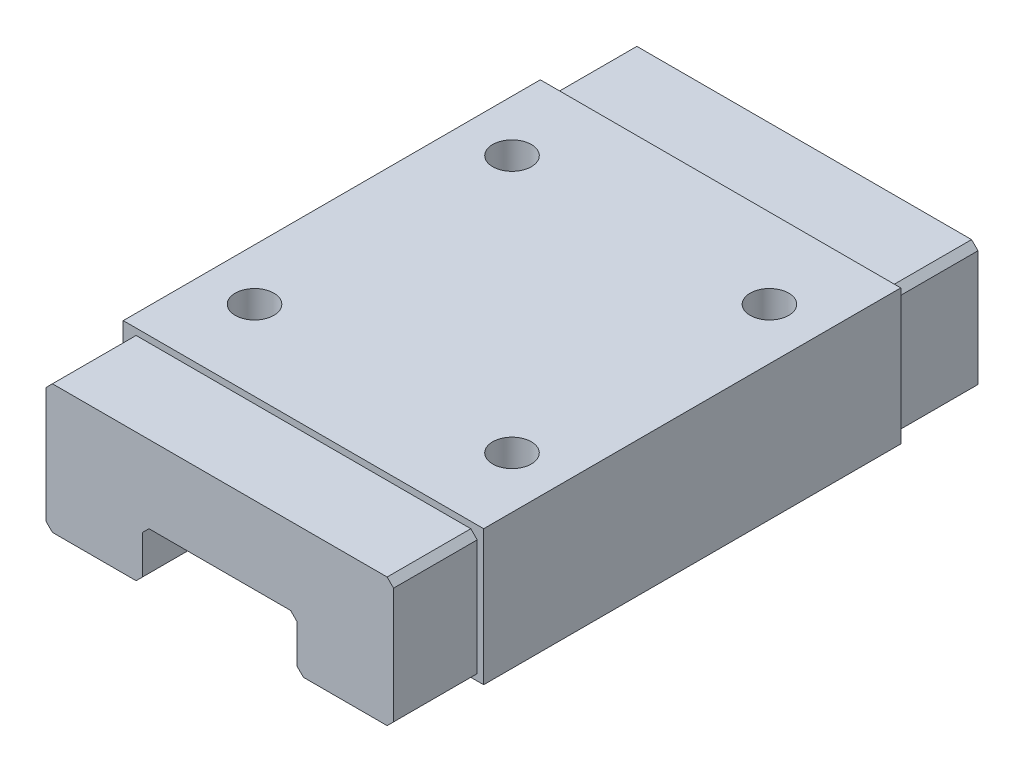
ISO-10303-21;
HEADER;
FILE_DESCRIPTION(('STEP AP214'),'2;1');
FILE_NAME('part.step','',(''),(''),'','','');
FILE_SCHEMA(('AUTOMOTIVE_DESIGN { 1 0 10303 214 1 1 1 1 }'));
ENDSEC;
DATA;
#1=APPLICATION_CONTEXT('core data for automotive mechanical design processes');
#2=APPLICATION_PROTOCOL_DEFINITION('international standard','automotive_design',2000,#1);
#3=PRODUCT_CONTEXT('',#1,'mechanical');
#4=PRODUCT('Part','Part','',(#3));
#5=PRODUCT_RELATED_PRODUCT_CATEGORY('part','',(#4));
#6=PRODUCT_DEFINITION_FORMATION('','',#4);
#7=PRODUCT_DEFINITION_CONTEXT('part definition',#1,'design');
#8=PRODUCT_DEFINITION('design','',#6,#7);
#9=PRODUCT_DEFINITION_SHAPE('','',#8);
#10=(LENGTH_UNIT() NAMED_UNIT(*) SI_UNIT(.MILLI.,.METRE.));
#11=(NAMED_UNIT(*) PLANE_ANGLE_UNIT() SI_UNIT($,.RADIAN.));
#12=(NAMED_UNIT(*) SI_UNIT($,.STERADIAN.) SOLID_ANGLE_UNIT());
#13=UNCERTAINTY_MEASURE_WITH_UNIT(LENGTH_MEASURE(1.E-05),#10,'distance_accuracy_value','');
#14=(GEOMETRIC_REPRESENTATION_CONTEXT(3) GLOBAL_UNCERTAINTY_ASSIGNED_CONTEXT((#13)) GLOBAL_UNIT_ASSIGNED_CONTEXT((#10,
#11,#12)) REPRESENTATION_CONTEXT('',''));
#15=CARTESIAN_POINT('',(0.,0.,0.));
#16=DIRECTION('',(0.,0.,1.));
#17=DIRECTION('',(1.,0.,0.));
#18=AXIS2_PLACEMENT_3D('',#15,#16,#17);
#19=CARTESIAN_POINT('',(13.5,0.,45.4));
#20=DIRECTION('',(-1.,0.,0.));
#21=DIRECTION('',(0.,-1.,0.));
#22=AXIS2_PLACEMENT_3D('',#19,#20,#21);
#23=PLANE('',#22);
#24=DIRECTION('',(0.,1.,0.));
#25=VECTOR('',#24,1.);
#26=CARTESIAN_POINT('',(13.5,0.,0.));
#27=LINE('',#26,#25);
#28=CARTESIAN_POINT('',(13.5,-9.49999999999999,0.));
#29=VERTEX_POINT('',#28);
#30=CARTESIAN_POINT('',(13.5,-0.500000000000001,0.));
#31=VERTEX_POINT('',#30);
#32=EDGE_CURVE('E279',#29,#31,#27,.T.);
#33=ORIENTED_EDGE('',*,*,#32,.T.);
#34=DIRECTION('',(0.,0.,1.));
#35=VECTOR('',#34,1.);
#36=CARTESIAN_POINT('',(13.5,-0.500000000000001,45.4));
#37=LINE('',#36,#35);
#38=CARTESIAN_POINT('',(13.5,-0.5,6.5));
#39=VERTEX_POINT('',#38);
#40=EDGE_CURVE('E349',#31,#39,#37,.T.);
#41=ORIENTED_EDGE('',*,*,#40,.T.);
#42=DIRECTION('',(0.,-1.,0.));
#43=VECTOR('',#42,1.);
#44=CARTESIAN_POINT('',(13.5,-10.,6.5));
#45=LINE('',#44,#43);
#46=CARTESIAN_POINT('',(13.5,-9.49999999999999,6.5));
#47=VERTEX_POINT('',#46);
#48=EDGE_CURVE('E240',#39,#47,#45,.T.);
#49=ORIENTED_EDGE('',*,*,#48,.T.);
#50=DIRECTION('',(0.,0.,-1.));
#51=VECTOR('',#50,1.);
#52=CARTESIAN_POINT('',(13.5,-9.49999999999999,45.4));
#53=LINE('',#52,#51);
#54=EDGE_CURVE('E346',#47,#29,#53,.T.);
#55=ORIENTED_EDGE('',*,*,#54,.T.);
#56=EDGE_LOOP('',(#33,#41,#49,#55));
#57=FACE_BOUND('',#56,.T.);
#58=ADVANCED_FACE('F34',(#57),#23,.F.);
#59=CARTESIAN_POINT('',(-13.5,0.,45.4));
#60=DIRECTION('',(0.,-1.,0.));
#61=DIRECTION('',(0.,0.,-1.));
#62=AXIS2_PLACEMENT_3D('',#59,#60,#61);
#63=PLANE('',#62);
#64=DIRECTION('',(1.,0.,0.));
#65=VECTOR('',#64,1.);
#66=CARTESIAN_POINT('',(13.5,0.,6.5));
#67=LINE('',#66,#65);
#68=CARTESIAN_POINT('',(-13.,0.,6.5));
#69=VERTEX_POINT('',#68);
#70=CARTESIAN_POINT('',(13.,0.,6.5));
#71=VERTEX_POINT('',#70);
#72=EDGE_CURVE('E225',#69,#71,#67,.T.);
#73=ORIENTED_EDGE('',*,*,#72,.T.);
#74=DIRECTION('',(0.,0.,-1.));
#75=VECTOR('',#74,1.);
#76=CARTESIAN_POINT('',(13.,0.,45.4));
#77=LINE('',#76,#75);
#78=CARTESIAN_POINT('',(13.,0.,0.));
#79=VERTEX_POINT('',#78);
#80=EDGE_CURVE('E331',#71,#79,#77,.T.);
#81=ORIENTED_EDGE('',*,*,#80,.T.);
#82=DIRECTION('',(-1.,0.,0.));
#83=VECTOR('',#82,1.);
#84=CARTESIAN_POINT('',(-13.5,0.,0.));
#85=LINE('',#84,#83);
#86=CARTESIAN_POINT('',(-13.,0.,0.));
#87=VERTEX_POINT('',#86);
#88=EDGE_CURVE('E311',#79,#87,#85,.T.);
#89=ORIENTED_EDGE('',*,*,#88,.T.);
#90=DIRECTION('',(0.,0.,1.));
#91=VECTOR('',#90,1.);
#92=CARTESIAN_POINT('',(-13.,0.,45.4));
#93=LINE('',#92,#91);
#94=EDGE_CURVE('E308',#87,#69,#93,.T.);
#95=ORIENTED_EDGE('',*,*,#94,.T.);
#96=EDGE_LOOP('',(#73,#81,#89,#95));
#97=FACE_BOUND('',#96,.T.);
#98=ADVANCED_FACE('F495',(#97),#63,.F.);
#99=CARTESIAN_POINT('',(-13.5,0.,45.4));
#100=DIRECTION('',(1.,0.,0.));
#101=DIRECTION('',(0.,1.,0.));
#102=AXIS2_PLACEMENT_3D('',#99,#100,#101);
#103=PLANE('',#102);
#104=DIRECTION('',(0.,1.,0.));
#105=VECTOR('',#104,1.);
#106=CARTESIAN_POINT('',(-13.5,0.,6.5));
#107=LINE('',#106,#105);
#108=CARTESIAN_POINT('',(-13.5,-9.50000000000001,6.5));
#109=VERTEX_POINT('',#108);
#110=CARTESIAN_POINT('',(-13.5,-0.499999999999994,6.5));
#111=VERTEX_POINT('',#110);
#112=EDGE_CURVE('E253',#109,#111,#107,.T.);
#113=ORIENTED_EDGE('',*,*,#112,.T.);
#114=DIRECTION('',(0.,0.,-1.));
#115=VECTOR('',#114,1.);
#116=CARTESIAN_POINT('',(-13.5,-0.499999999999994,45.4));
#117=LINE('',#116,#115);
#118=CARTESIAN_POINT('',(-13.5,-0.499999999999995,0.));
#119=VERTEX_POINT('',#118);
#120=EDGE_CURVE('E375',#111,#119,#117,.T.);
#121=ORIENTED_EDGE('',*,*,#120,.T.);
#122=DIRECTION('',(0.,-1.,0.));
#123=VECTOR('',#122,1.);
#124=CARTESIAN_POINT('',(-13.5,0.,0.));
#125=LINE('',#124,#123);
#126=CARTESIAN_POINT('',(-13.5,-9.50000000000001,0.));
#127=VERTEX_POINT('',#126);
#128=EDGE_CURVE('E314',#119,#127,#125,.T.);
#129=ORIENTED_EDGE('',*,*,#128,.T.);
#130=DIRECTION('',(0.,0.,1.));
#131=VECTOR('',#130,1.);
#132=CARTESIAN_POINT('',(-13.5,-9.50000000000001,45.4));
#133=LINE('',#132,#131);
#134=EDGE_CURVE('E373',#127,#109,#133,.T.);
#135=ORIENTED_EDGE('',*,*,#134,.T.);
#136=EDGE_LOOP('',(#113,#121,#129,#135));
#137=FACE_BOUND('',#136,.T.);
#138=ADVANCED_FACE('F487',(#137),#103,.F.);
#139=DIRECTION('',(0.,-1.,0.));
#140=VECTOR('',#139,1.);
#141=CARTESIAN_POINT('',(13.5,-10.,38.9));
#142=LINE('',#141,#140);
#143=CARTESIAN_POINT('',(13.5,-0.5,38.9));
#144=VERTEX_POINT('',#143);
#145=CARTESIAN_POINT('',(13.5,-9.49999999999999,38.9));
#146=VERTEX_POINT('',#145);
#147=EDGE_CURVE('E258',#144,#146,#142,.T.);
#148=ORIENTED_EDGE('',*,*,#147,.F.);
#149=DIRECTION('',(0.,0.,1.));
#150=VECTOR('',#149,1.);
#151=CARTESIAN_POINT('',(13.5,-0.500000000000001,45.4));
#152=LINE('',#151,#150);
#153=CARTESIAN_POINT('',(13.5,-0.500000000000001,45.4));
#154=VERTEX_POINT('',#153);
#155=EDGE_CURVE('E359',#144,#154,#152,.T.);
#156=ORIENTED_EDGE('',*,*,#155,.T.);
#157=DIRECTION('',(0.,1.,0.));
#158=VECTOR('',#157,1.);
#159=CARTESIAN_POINT('',(13.5,0.,45.4));
#160=LINE('',#159,#158);
#161=CARTESIAN_POINT('',(13.5,-9.49999999999999,45.4));
#162=VERTEX_POINT('',#161);
#163=EDGE_CURVE('E283',#162,#154,#160,.T.);
#164=ORIENTED_EDGE('',*,*,#163,.F.);
#165=DIRECTION('',(0.,0.,-1.));
#166=VECTOR('',#165,1.);
#167=CARTESIAN_POINT('',(13.5,-9.49999999999999,45.4));
#168=LINE('',#167,#166);
#169=EDGE_CURVE('E356',#162,#146,#168,.T.);
#170=ORIENTED_EDGE('',*,*,#169,.T.);
#171=EDGE_LOOP('',(#148,#156,#164,#170));
#172=FACE_BOUND('',#171,.T.);
#173=ADVANCED_FACE('F542',(#172),#23,.F.);
#174=DIRECTION('',(-1.,0.,0.));
#175=VECTOR('',#174,1.);
#176=CARTESIAN_POINT('',(-13.5,0.,45.4));
#177=LINE('',#176,#175);
#178=CARTESIAN_POINT('',(13.,0.,45.4));
#179=VERTEX_POINT('',#178);
#180=CARTESIAN_POINT('',(-13.,0.,45.4));
#181=VERTEX_POINT('',#180);
#182=EDGE_CURVE('E286',#179,#181,#177,.T.);
#183=ORIENTED_EDGE('',*,*,#182,.F.);
#184=DIRECTION('',(0.,0.,-1.));
#185=VECTOR('',#184,1.);
#186=CARTESIAN_POINT('',(13.,0.,45.4));
#187=LINE('',#186,#185);
#188=CARTESIAN_POINT('',(13.,0.,38.9));
#189=VERTEX_POINT('',#188);
#190=EDGE_CURVE('E353',#179,#189,#187,.T.);
#191=ORIENTED_EDGE('',*,*,#190,.T.);
#192=DIRECTION('',(1.,0.,0.));
#193=VECTOR('',#192,1.);
#194=CARTESIAN_POINT('',(13.5,0.,38.9));
#195=LINE('',#194,#193);
#196=CARTESIAN_POINT('',(-13.,0.,38.9));
#197=VERTEX_POINT('',#196);
#198=EDGE_CURVE('E243',#197,#189,#195,.T.);
#199=ORIENTED_EDGE('',*,*,#198,.F.);
#200=DIRECTION('',(0.,0.,1.));
#201=VECTOR('',#200,1.);
#202=CARTESIAN_POINT('',(-13.,0.,45.4));
#203=LINE('',#202,#201);
#204=EDGE_CURVE('E351',#197,#181,#203,.T.);
#205=ORIENTED_EDGE('',*,*,#204,.T.);
#206=EDGE_LOOP('',(#183,#191,#199,#205));
#207=FACE_BOUND('',#206,.T.);
#208=ADVANCED_FACE('F535',(#207),#63,.F.);
#209=DIRECTION('',(0.,-1.,0.));
#210=VECTOR('',#209,1.);
#211=CARTESIAN_POINT('',(-13.5,0.,45.4));
#212=LINE('',#211,#210);
#213=CARTESIAN_POINT('',(-13.5,-0.499999999999994,45.4));
#214=VERTEX_POINT('',#213);
#215=CARTESIAN_POINT('',(-13.5,-9.50000000000001,45.4));
#216=VERTEX_POINT('',#215);
#217=EDGE_CURVE('E290',#214,#216,#212,.T.);
#218=ORIENTED_EDGE('',*,*,#217,.F.);
#219=DIRECTION('',(0.,0.,-1.));
#220=VECTOR('',#219,1.);
#221=CARTESIAN_POINT('',(-13.5,-0.499999999999994,45.4));
#222=LINE('',#221,#220);
#223=CARTESIAN_POINT('',(-13.5,-0.499999999999994,38.9));
#224=VERTEX_POINT('',#223);
#225=EDGE_CURVE('E380',#214,#224,#222,.T.);
#226=ORIENTED_EDGE('',*,*,#225,.T.);
#227=DIRECTION('',(0.,1.,0.));
#228=VECTOR('',#227,1.);
#229=CARTESIAN_POINT('',(-13.5,0.,38.9));
#230=LINE('',#229,#228);
#231=CARTESIAN_POINT('',(-13.5,-9.50000000000001,38.9));
#232=VERTEX_POINT('',#231);
#233=EDGE_CURVE('E272',#232,#224,#230,.T.);
#234=ORIENTED_EDGE('',*,*,#233,.F.);
#235=DIRECTION('',(0.,0.,1.));
#236=VECTOR('',#235,1.);
#237=CARTESIAN_POINT('',(-13.5,-9.50000000000001,45.4));
#238=LINE('',#237,#236);
#239=EDGE_CURVE('E378',#232,#216,#238,.T.);
#240=ORIENTED_EDGE('',*,*,#239,.T.);
#241=EDGE_LOOP('',(#218,#226,#234,#240));
#242=FACE_BOUND('',#241,.T.);
#243=ADVANCED_FACE('F526',(#242),#103,.F.);
#244=CARTESIAN_POINT('',(-13.5,-10.,45.4));
#245=DIRECTION('',(0.,1.,0.));
#246=DIRECTION('',(-1.,0.,0.));
#247=AXIS2_PLACEMENT_3D('',#244,#245,#246);
#248=PLANE('',#247);
#249=DIRECTION('',(1.,0.,0.));
#250=VECTOR('',#249,1.);
#251=CARTESIAN_POINT('',(-13.5,-10.,6.5));
#252=LINE('',#251,#250);
#253=CARTESIAN_POINT('',(-14.,-10.,6.5));
#254=VERTEX_POINT('',#253);
#255=CARTESIAN_POINT('',(-13.,-10.,6.5));
#256=VERTEX_POINT('',#255);
#257=EDGE_CURVE('E251',#254,#256,#252,.T.);
#258=ORIENTED_EDGE('',*,*,#257,.T.);
#259=DIRECTION('',(0.,0.,-1.));
#260=VECTOR('',#259,1.);
#261=CARTESIAN_POINT('',(-13.,-10.,45.4));
#262=LINE('',#261,#260);
#263=CARTESIAN_POINT('',(-13.,-10.,0.));
#264=VERTEX_POINT('',#263);
#265=EDGE_CURVE('E388',#256,#264,#262,.T.);
#266=ORIENTED_EDGE('',*,*,#265,.T.);
#267=DIRECTION('',(1.,0.,0.));
#268=VECTOR('',#267,1.);
#269=CARTESIAN_POINT('',(-13.5,-10.,0.));
#270=LINE('',#269,#268);
#271=CARTESIAN_POINT('',(-6.49999999999999,-10.,0.));
#272=VERTEX_POINT('',#271);
#273=EDGE_CURVE('E317',#264,#272,#270,.T.);
#274=ORIENTED_EDGE('',*,*,#273,.T.);
#275=DIRECTION('',(0.,0.,1.));
#276=VECTOR('',#275,1.);
#277=CARTESIAN_POINT('',(-6.49999999999999,-10.,45.4));
#278=LINE('',#277,#276);
#279=CARTESIAN_POINT('',(-6.49999999999999,-10.,45.4));
#280=VERTEX_POINT('',#279);
#281=EDGE_CURVE('E383',#272,#280,#278,.T.);
#282=ORIENTED_EDGE('',*,*,#281,.T.);
#283=DIRECTION('',(1.,0.,0.));
#284=VECTOR('',#283,1.);
#285=CARTESIAN_POINT('',(-13.5,-10.,45.4));
#286=LINE('',#285,#284);
#287=CARTESIAN_POINT('',(-13.,-10.,45.4));
#288=VERTEX_POINT('',#287);
#289=EDGE_CURVE('E293',#288,#280,#286,.T.);
#290=ORIENTED_EDGE('',*,*,#289,.F.);
#291=DIRECTION('',(0.,0.,-1.));
#292=VECTOR('',#291,1.);
#293=CARTESIAN_POINT('',(-13.,-10.,45.4));
#294=LINE('',#293,#292);
#295=CARTESIAN_POINT('',(-13.,-10.,38.9));
#296=VERTEX_POINT('',#295);
#297=EDGE_CURVE('E385',#288,#296,#294,.T.);
#298=ORIENTED_EDGE('',*,*,#297,.T.);
#299=DIRECTION('',(1.,0.,0.));
#300=VECTOR('',#299,1.);
#301=CARTESIAN_POINT('',(-13.5,-10.,38.9));
#302=LINE('',#301,#300);
#303=CARTESIAN_POINT('',(-14.,-10.,38.9));
#304=VERTEX_POINT('',#303);
#305=EDGE_CURVE('E270',#304,#296,#302,.T.);
#306=ORIENTED_EDGE('',*,*,#305,.F.);
#307=DIRECTION('',(0.,0.,1.));
#308=VECTOR('',#307,1.);
#309=CARTESIAN_POINT('',(-14.,-10.,6.5));
#310=LINE('',#309,#308);
#311=EDGE_CURVE('E277',#254,#304,#310,.T.);
#312=ORIENTED_EDGE('',*,*,#311,.F.);
#313=EDGE_LOOP('',(#258,#266,#274,#282,#290,#298,#306,#312));
#314=FACE_BOUND('',#313,.T.);
#315=ADVANCED_FACE('F477',(#314),#248,.F.);
#316=CARTESIAN_POINT('',(-6.,-10.,45.4));
#317=DIRECTION('',(-1.,0.,0.));
#318=DIRECTION('',(0.,-1.,0.));
#319=AXIS2_PLACEMENT_3D('',#316,#317,#318);
#320=PLANE('',#319);
#321=DIRECTION('',(0.,1.,0.));
#322=VECTOR('',#321,1.);
#323=CARTESIAN_POINT('',(-6.,-10.,45.4));
#324=LINE('',#323,#322);
#325=CARTESIAN_POINT('',(-6.,-9.50000000000001,45.4));
#326=VERTEX_POINT('',#325);
#327=CARTESIAN_POINT('',(-6.,-6.5,45.4));
#328=VERTEX_POINT('',#327);
#329=EDGE_CURVE('E296',#326,#328,#324,.T.);
#330=ORIENTED_EDGE('',*,*,#329,.F.);
#331=DIRECTION('',(0.,0.,-1.));
#332=VECTOR('',#331,1.);
#333=CARTESIAN_POINT('',(-6.,-9.50000000000001,45.4));
#334=LINE('',#333,#332);
#335=CARTESIAN_POINT('',(-6.,-9.50000000000001,0.));
#336=VERTEX_POINT('',#335);
#337=EDGE_CURVE('E393',#326,#336,#334,.T.);
#338=ORIENTED_EDGE('',*,*,#337,.T.);
#339=DIRECTION('',(0.,1.,0.));
#340=VECTOR('',#339,1.);
#341=CARTESIAN_POINT('',(-6.,-10.,0.));
#342=LINE('',#341,#340);
#343=CARTESIAN_POINT('',(-6.,-6.5,0.));
#344=VERTEX_POINT('',#343);
#345=EDGE_CURVE('E320',#336,#344,#342,.T.);
#346=ORIENTED_EDGE('',*,*,#345,.T.);
#347=DIRECTION('',(0.,0.,1.));
#348=VECTOR('',#347,1.);
#349=CARTESIAN_POINT('',(-6.,-6.5,45.4));
#350=LINE('',#349,#348);
#351=EDGE_CURVE('E391',#344,#328,#350,.T.);
#352=ORIENTED_EDGE('',*,*,#351,.T.);
#353=EDGE_LOOP('',(#330,#338,#346,#352));
#354=FACE_BOUND('',#353,.T.);
#355=ADVANCED_FACE('F469',(#354),#320,.F.);
#356=CARTESIAN_POINT('',(6.00000000000001,-6.,45.4));
#357=DIRECTION('',(0.,1.,0.));
#358=DIRECTION('',(-1.,0.,0.));
#359=AXIS2_PLACEMENT_3D('',#356,#357,#358);
#360=PLANE('',#359);
#361=DIRECTION('',(1.,0.,0.));
#362=VECTOR('',#361,1.);
#363=CARTESIAN_POINT('',(6.00000000000001,-6.,45.4));
#364=LINE('',#363,#362);
#365=CARTESIAN_POINT('',(-5.49999999999999,-6.,45.4));
#366=VERTEX_POINT('',#365);
#367=CARTESIAN_POINT('',(5.50000000000001,-6.,45.4));
#368=VERTEX_POINT('',#367);
#369=EDGE_CURVE('E299',#366,#368,#364,.T.);
#370=ORIENTED_EDGE('',*,*,#369,.F.);
#371=DIRECTION('',(0.,0.,-1.));
#372=VECTOR('',#371,1.);
#373=CARTESIAN_POINT('',(-5.49999999999999,-6.,0.));
#374=LINE('',#373,#372);
#375=CARTESIAN_POINT('',(-5.49999999999999,-6.,0.));
#376=VERTEX_POINT('',#375);
#377=EDGE_CURVE('E398',#366,#376,#374,.T.);
#378=ORIENTED_EDGE('',*,*,#377,.T.);
#379=DIRECTION('',(1.,0.,0.));
#380=VECTOR('',#379,1.);
#381=CARTESIAN_POINT('',(6.00000000000001,-6.,0.));
#382=LINE('',#381,#380);
#383=CARTESIAN_POINT('',(5.50000000000001,-6.,0.));
#384=VERTEX_POINT('',#383);
#385=EDGE_CURVE('E323',#376,#384,#382,.T.);
#386=ORIENTED_EDGE('',*,*,#385,.T.);
#387=DIRECTION('',(0.,0.,1.));
#388=VECTOR('',#387,1.);
#389=CARTESIAN_POINT('',(5.50000000000001,-6.,45.4));
#390=LINE('',#389,#388);
#391=EDGE_CURVE('E396',#384,#368,#390,.T.);
#392=ORIENTED_EDGE('',*,*,#391,.T.);
#393=EDGE_LOOP('',(#370,#378,#386,#392));
#394=FACE_BOUND('',#393,.T.);
#395=ADVANCED_FACE('F460',(#394),#360,.F.);
#396=CARTESIAN_POINT('',(6.00000000000001,-10.,45.4));
#397=DIRECTION('',(1.,0.,0.));
#398=DIRECTION('',(0.,0.,-1.));
#399=AXIS2_PLACEMENT_3D('',#396,#397,#398);
#400=PLANE('',#399);
#401=DIRECTION('',(0.,-1.,0.));
#402=VECTOR('',#401,1.);
#403=CARTESIAN_POINT('',(6.00000000000001,-10.,45.4));
#404=LINE('',#403,#402);
#405=CARTESIAN_POINT('',(6.00000000000001,-6.50000000000001,45.4));
#406=VERTEX_POINT('',#405);
#407=CARTESIAN_POINT('',(6.00000000000001,-9.5,45.4));
#408=VERTEX_POINT('',#407);
#409=EDGE_CURVE('E302',#406,#408,#404,.T.);
#410=ORIENTED_EDGE('',*,*,#409,.F.);
#411=DIRECTION('',(0.,0.,-1.));
#412=VECTOR('',#411,1.);
#413=CARTESIAN_POINT('',(6.00000000000001,-6.50000000000001,0.));
#414=LINE('',#413,#412);
#415=CARTESIAN_POINT('',(6.00000000000001,-6.50000000000001,0.));
#416=VERTEX_POINT('',#415);
#417=EDGE_CURVE('E403',#406,#416,#414,.T.);
#418=ORIENTED_EDGE('',*,*,#417,.T.);
#419=DIRECTION('',(0.,-1.,0.));
#420=VECTOR('',#419,1.);
#421=CARTESIAN_POINT('',(6.00000000000001,-10.,0.));
#422=LINE('',#421,#420);
#423=CARTESIAN_POINT('',(6.00000000000001,-9.5,0.));
#424=VERTEX_POINT('',#423);
#425=EDGE_CURVE('E326',#416,#424,#422,.T.);
#426=ORIENTED_EDGE('',*,*,#425,.T.);
#427=DIRECTION('',(0.,0.,1.));
#428=VECTOR('',#427,1.);
#429=CARTESIAN_POINT('',(6.00000000000001,-9.5,45.4));
#430=LINE('',#429,#428);
#431=EDGE_CURVE('E401',#424,#408,#430,.T.);
#432=ORIENTED_EDGE('',*,*,#431,.T.);
#433=EDGE_LOOP('',(#410,#418,#426,#432));
#434=FACE_BOUND('',#433,.T.);
#435=ADVANCED_FACE('F451',(#434),#400,.F.);
#436=CARTESIAN_POINT('',(13.5,-10.,45.4));
#437=DIRECTION('',(0.,1.,0.));
#438=DIRECTION('',(0.,0.,1.));
#439=AXIS2_PLACEMENT_3D('',#436,#437,#438);
#440=PLANE('',#439);
#441=DIRECTION('',(1.,0.,0.));
#442=VECTOR('',#441,1.);
#443=CARTESIAN_POINT('',(13.5,-10.,45.4));
#444=LINE('',#443,#442);
#445=CARTESIAN_POINT('',(6.50000000000001,-10.,45.4));
#446=VERTEX_POINT('',#445);
#447=CARTESIAN_POINT('',(13.,-10.,45.4));
#448=VERTEX_POINT('',#447);
#449=EDGE_CURVE('E305',#446,#448,#444,.T.);
#450=ORIENTED_EDGE('',*,*,#449,.F.);
#451=DIRECTION('',(0.,0.,-1.));
#452=VECTOR('',#451,1.);
#453=CARTESIAN_POINT('',(6.50000000000001,-10.,45.4));
#454=LINE('',#453,#452);
#455=CARTESIAN_POINT('',(6.50000000000001,-10.,0.));
#456=VERTEX_POINT('',#455);
#457=EDGE_CURVE('E409',#446,#456,#454,.T.);
#458=ORIENTED_EDGE('',*,*,#457,.T.);
#459=DIRECTION('',(1.,0.,0.));
#460=VECTOR('',#459,1.);
#461=CARTESIAN_POINT('',(13.5,-10.,0.));
#462=LINE('',#461,#460);
#463=CARTESIAN_POINT('',(13.,-10.,0.));
#464=VERTEX_POINT('',#463);
#465=EDGE_CURVE('E287',#456,#464,#462,.T.);
#466=ORIENTED_EDGE('',*,*,#465,.T.);
#467=DIRECTION('',(0.,0.,1.));
#468=VECTOR('',#467,1.);
#469=CARTESIAN_POINT('',(13.,-10.,45.4));
#470=LINE('',#469,#468);
#471=CARTESIAN_POINT('',(13.,-10.,6.5));
#472=VERTEX_POINT('',#471);
#473=EDGE_CURVE('E238',#464,#472,#470,.T.);
#474=ORIENTED_EDGE('',*,*,#473,.T.);
#475=DIRECTION('',(1.,0.,0.));
#476=VECTOR('',#475,1.);
#477=CARTESIAN_POINT('',(13.5,-10.,6.5));
#478=LINE('',#477,#476);
#479=CARTESIAN_POINT('',(14.,-10.,6.5));
#480=VERTEX_POINT('',#479);
#481=EDGE_CURVE('E49',#472,#480,#478,.T.);
#482=ORIENTED_EDGE('',*,*,#481,.T.);
#483=DIRECTION('',(0.,0.,1.));
#484=VECTOR('',#483,1.);
#485=CARTESIAN_POINT('',(14.,-10.,6.5));
#486=LINE('',#485,#484);
#487=CARTESIAN_POINT('',(14.,-10.,38.9));
#488=VERTEX_POINT('',#487);
#489=EDGE_CURVE('E219',#480,#488,#486,.T.);
#490=ORIENTED_EDGE('',*,*,#489,.T.);
#491=DIRECTION('',(1.,0.,0.));
#492=VECTOR('',#491,1.);
#493=CARTESIAN_POINT('',(13.5,-10.,38.9));
#494=LINE('',#493,#492);
#495=CARTESIAN_POINT('',(13.,-10.,38.9));
#496=VERTEX_POINT('',#495);
#497=EDGE_CURVE('E57',#496,#488,#494,.T.);
#498=ORIENTED_EDGE('',*,*,#497,.F.);
#499=DIRECTION('',(0.,0.,1.));
#500=VECTOR('',#499,1.);
#501=CARTESIAN_POINT('',(13.,-10.,45.4));
#502=LINE('',#501,#500);
#503=EDGE_CURVE('E406',#496,#448,#502,.T.);
#504=ORIENTED_EDGE('',*,*,#503,.T.);
#505=EDGE_LOOP('',(#450,#458,#466,#474,#482,#490,#498,#504));
#506=FACE_BOUND('',#505,.T.);
#507=ADVANCED_FACE('F235',(#506),#440,.F.);
#508=CARTESIAN_POINT('',(0.,0.,45.4));
#509=DIRECTION('',(0.,0.,-1.));
#510=DIRECTION('',(-1.,0.,0.));
#511=AXIS2_PLACEMENT_3D('',#508,#509,#510);
#512=PLANE('',#511);
#513=ORIENTED_EDGE('',*,*,#163,.T.);
#514=DIRECTION('',(0.707106781186552,-0.707106781186543,0.));
#515=VECTOR('',#514,1.);
#516=CARTESIAN_POINT('',(13.,0.,45.4));
#517=LINE('',#516,#515);
#518=EDGE_CURVE('E371',#154,#179,#517,.F.);
#519=ORIENTED_EDGE('',*,*,#518,.T.);
#520=ORIENTED_EDGE('',*,*,#182,.T.);
#521=DIRECTION('',(0.707106781186548,0.707106781186548,0.));
#522=VECTOR('',#521,1.);
#523=CARTESIAN_POINT('',(-13.5,-0.499999999999994,45.4));
#524=LINE('',#523,#522);
#525=EDGE_CURVE('E369',#181,#214,#524,.F.);
#526=ORIENTED_EDGE('',*,*,#525,.T.);
#527=ORIENTED_EDGE('',*,*,#217,.T.);
#528=DIRECTION('',(-0.707106781186548,0.707106781186548,0.));
#529=VECTOR('',#528,1.);
#530=CARTESIAN_POINT('',(-13.,-10.,45.4));
#531=LINE('',#530,#529);
#532=EDGE_CURVE('E367',#216,#288,#531,.F.);
#533=ORIENTED_EDGE('',*,*,#532,.T.);
#534=ORIENTED_EDGE('',*,*,#289,.T.);
#535=DIRECTION('',(-0.707106781186548,-0.707106781186548,0.));
#536=VECTOR('',#535,1.);
#537=CARTESIAN_POINT('',(-6.,-9.50000000000001,45.4));
#538=LINE('',#537,#536);
#539=EDGE_CURVE('E365',#280,#326,#538,.F.);
#540=ORIENTED_EDGE('',*,*,#539,.T.);
#541=ORIENTED_EDGE('',*,*,#329,.T.);
#542=DIRECTION('',(-0.707106781186552,-0.707106781186543,0.));
#543=VECTOR('',#542,1.);
#544=CARTESIAN_POINT('',(0.250000000000043,-0.250000000000046,45.4));
#545=LINE('',#544,#543);
#546=EDGE_CURVE('E427',#328,#366,#545,.F.);
#547=ORIENTED_EDGE('',*,*,#546,.T.);
#548=ORIENTED_EDGE('',*,*,#369,.T.);
#549=DIRECTION('',(-0.707106781186543,0.707106781186552,0.));
#550=VECTOR('',#549,1.);
#551=CARTESIAN_POINT('',(-0.249999999999959,-0.249999999999956,45.4));
#552=LINE('',#551,#550);
#553=EDGE_CURVE('E431',#368,#406,#552,.F.);
#554=ORIENTED_EDGE('',*,*,#553,.T.);
#555=ORIENTED_EDGE('',*,*,#409,.T.);
#556=DIRECTION('',(-0.707106781186548,0.707106781186548,0.));
#557=VECTOR('',#556,1.);
#558=CARTESIAN_POINT('',(6.50000000000001,-10.,45.4));
#559=LINE('',#558,#557);
#560=EDGE_CURVE('E363',#408,#446,#559,.F.);
#561=ORIENTED_EDGE('',*,*,#560,.T.);
#562=ORIENTED_EDGE('',*,*,#449,.T.);
#563=DIRECTION('',(-0.707106781186552,-0.707106781186543,0.));
#564=VECTOR('',#563,1.);
#565=CARTESIAN_POINT('',(13.5,-9.49999999999999,45.4));
#566=LINE('',#565,#564);
#567=EDGE_CURVE('E361',#448,#162,#566,.F.);
#568=ORIENTED_EDGE('',*,*,#567,.T.);
#569=EDGE_LOOP('',(#513,#519,#520,#526,#527,#533,#534,#540,#541,#547,#548,#554,#555,#561,#562,#568));
#570=FACE_BOUND('',#569,.T.);
#571=ADVANCED_FACE('F515',(#570),#512,.F.);
#572=CARTESIAN_POINT('',(0.,0.,0.));
#573=DIRECTION('',(0.,0.,-1.));
#574=DIRECTION('',(-1.,0.,0.));
#575=AXIS2_PLACEMENT_3D('',#572,#573,#574);
#576=PLANE('',#575);
#577=ORIENTED_EDGE('',*,*,#88,.F.);
#578=DIRECTION('',(-0.707106781186552,0.707106781186543,0.));
#579=VECTOR('',#578,1.);
#580=CARTESIAN_POINT('',(6.4999999999999,6.5,0.));
#581=LINE('',#580,#579);
#582=EDGE_CURVE('E344',#79,#31,#581,.F.);
#583=ORIENTED_EDGE('',*,*,#582,.T.);
#584=ORIENTED_EDGE('',*,*,#32,.F.);
#585=DIRECTION('',(0.707106781186552,0.707106781186543,0.));
#586=VECTOR('',#585,1.);
#587=CARTESIAN_POINT('',(11.4999999999999,-11.5000000000001,0.));
#588=LINE('',#587,#586);
#589=EDGE_CURVE('E334',#29,#464,#588,.F.);
#590=ORIENTED_EDGE('',*,*,#589,.T.);
#591=ORIENTED_EDGE('',*,*,#465,.F.);
#592=DIRECTION('',(0.707106781186548,-0.707106781186548,0.));
#593=VECTOR('',#592,1.);
#594=CARTESIAN_POINT('',(-1.75,-1.75,0.));
#595=LINE('',#594,#593);
#596=EDGE_CURVE('E336',#456,#424,#595,.F.);
#597=ORIENTED_EDGE('',*,*,#596,.T.);
#598=ORIENTED_EDGE('',*,*,#425,.F.);
#599=DIRECTION('',(0.707106781186543,-0.707106781186552,0.));
#600=VECTOR('',#599,1.);
#601=CARTESIAN_POINT('',(6.00000000000001,-6.50000000000001,0.));
#602=LINE('',#601,#600);
#603=EDGE_CURVE('E429',#416,#384,#602,.F.);
#604=ORIENTED_EDGE('',*,*,#603,.T.);
#605=ORIENTED_EDGE('',*,*,#385,.F.);
#606=DIRECTION('',(0.707106781186552,0.707106781186543,0.));
#607=VECTOR('',#606,1.);
#608=CARTESIAN_POINT('',(-5.49999999999999,-6.,0.));
#609=LINE('',#608,#607);
#610=EDGE_CURVE('E425',#376,#344,#609,.F.);
#611=ORIENTED_EDGE('',*,*,#610,.T.);
#612=ORIENTED_EDGE('',*,*,#345,.F.);
#613=DIRECTION('',(0.707106781186548,0.707106781186548,0.));
#614=VECTOR('',#613,1.);
#615=CARTESIAN_POINT('',(1.75000000000001,-1.75000000000001,0.));
#616=LINE('',#615,#614);
#617=EDGE_CURVE('E338',#336,#272,#616,.F.);
#618=ORIENTED_EDGE('',*,*,#617,.T.);
#619=ORIENTED_EDGE('',*,*,#273,.F.);
#620=DIRECTION('',(0.707106781186548,-0.707106781186548,0.));
#621=VECTOR('',#620,1.);
#622=CARTESIAN_POINT('',(-11.5,-11.5,0.));
#623=LINE('',#622,#621);
#624=EDGE_CURVE('E340',#264,#127,#623,.F.);
#625=ORIENTED_EDGE('',*,*,#624,.T.);
#626=ORIENTED_EDGE('',*,*,#128,.F.);
#627=DIRECTION('',(-0.707106781186548,-0.707106781186548,0.));
#628=VECTOR('',#627,1.);
#629=CARTESIAN_POINT('',(-6.5,6.5,0.));
#630=LINE('',#629,#628);
#631=EDGE_CURVE('E342',#119,#87,#630,.F.);
#632=ORIENTED_EDGE('',*,*,#631,.T.);
#633=EDGE_LOOP('',(#577,#583,#584,#590,#591,#597,#598,#604,#605,#611,#612,#618,#619,#625,#626,#632));
#634=FACE_BOUND('',#633,.T.);
#635=ADVANCED_FACE('F442',(#634),#576,.T.);
#636=CARTESIAN_POINT('',(-14.,0.5,6.5));
#637=DIRECTION('',(-1.,0.,0.));
#638=DIRECTION('',(0.,0.,1.));
#639=AXIS2_PLACEMENT_3D('',#636,#637,#638);
#640=PLANE('',#639);
#641=DIRECTION('',(0.,-1.,0.));
#642=VECTOR('',#641,1.);
#643=CARTESIAN_POINT('',(-14.,0.5,38.9));
#644=LINE('',#643,#642);
#645=CARTESIAN_POINT('',(-14.,0.5,38.9));
#646=VERTEX_POINT('',#645);
#647=EDGE_CURVE('E267',#646,#304,#644,.T.);
#648=ORIENTED_EDGE('',*,*,#647,.F.);
#649=DIRECTION('',(0.,0.,1.));
#650=VECTOR('',#649,1.);
#651=CARTESIAN_POINT('',(-14.,0.5,6.5));
#652=LINE('',#651,#650);
#653=CARTESIAN_POINT('',(-14.,0.5,6.5));
#654=VERTEX_POINT('',#653);
#655=EDGE_CURVE('E280',#654,#646,#652,.T.);
#656=ORIENTED_EDGE('',*,*,#655,.F.);
#657=DIRECTION('',(0.,-1.,0.));
#658=VECTOR('',#657,1.);
#659=CARTESIAN_POINT('',(-14.,0.5,6.5));
#660=LINE('',#659,#658);
#661=EDGE_CURVE('E248',#654,#254,#660,.T.);
#662=ORIENTED_EDGE('',*,*,#661,.T.);
#663=ORIENTED_EDGE('',*,*,#311,.T.);
#664=EDGE_LOOP('',(#648,#656,#662,#663));
#665=FACE_BOUND('',#664,.T.);
#666=ADVANCED_FACE('F502',(#665),#640,.T.);
#667=CARTESIAN_POINT('',(14.,0.5,6.5));
#668=DIRECTION('',(0.,1.,0.));
#669=DIRECTION('',(0.,0.,1.));
#670=AXIS2_PLACEMENT_3D('',#667,#668,#669);
#671=PLANE('',#670);
#672=CARTESIAN_POINT('',(-10.,0.5,12.7));
#673=DIRECTION('',(0.,1.,0.));
#674=DIRECTION('',(0.,0.,-1.));
#675=AXIS2_PLACEMENT_3D('',#672,#673,#674);
#676=CIRCLE('',#675,1.5);
#677=CARTESIAN_POINT('',(-10.,0.5,11.2));
#678=VERTEX_POINT('',#677);
#679=EDGE_CURVE('E622',#678,#678,#676,.T.);
#680=ORIENTED_EDGE('',*,*,#679,.F.);
#681=EDGE_LOOP('',(#680));
#682=FACE_BOUND('',#681,.T.);
#683=CARTESIAN_POINT('',(-10.,0.5,32.7));
#684=DIRECTION('',(0.,1.,0.));
#685=DIRECTION('',(0.,0.,1.));
#686=AXIS2_PLACEMENT_3D('',#683,#684,#685);
#687=CIRCLE('',#686,1.5);
#688=CARTESIAN_POINT('',(-10.,0.5,34.2));
#689=VERTEX_POINT('',#688);
#690=EDGE_CURVE('E621',#689,#689,#687,.T.);
#691=ORIENTED_EDGE('',*,*,#690,.F.);
#692=EDGE_LOOP('',(#691));
#693=FACE_BOUND('',#692,.T.);
#694=CARTESIAN_POINT('',(10.,0.5,32.7));
#695=DIRECTION('',(0.,1.,0.));
#696=DIRECTION('',(0.,0.,-1.));
#697=AXIS2_PLACEMENT_3D('',#694,#695,#696);
#698=CIRCLE('',#697,1.5);
#699=CARTESIAN_POINT('',(10.,0.5,31.2));
#700=VERTEX_POINT('',#699);
#701=EDGE_CURVE('E631',#700,#700,#698,.T.);
#702=ORIENTED_EDGE('',*,*,#701,.F.);
#703=EDGE_LOOP('',(#702));
#704=FACE_BOUND('',#703,.T.);
#705=CARTESIAN_POINT('',(10.,0.5,12.7));
#706=DIRECTION('',(0.,1.,0.));
#707=DIRECTION('',(0.,0.,1.));
#708=AXIS2_PLACEMENT_3D('',#705,#706,#707);
#709=CIRCLE('',#708,1.5);
#710=CARTESIAN_POINT('',(10.,0.5,14.2));
#711=VERTEX_POINT('',#710);
#712=EDGE_CURVE('E636',#711,#711,#709,.T.);
#713=ORIENTED_EDGE('',*,*,#712,.F.);
#714=EDGE_LOOP('',(#713));
#715=FACE_BOUND('',#714,.T.);
#716=DIRECTION('',(-1.,0.,0.));
#717=VECTOR('',#716,1.);
#718=CARTESIAN_POINT('',(14.,0.5,38.9));
#719=LINE('',#718,#717);
#720=CARTESIAN_POINT('',(14.,0.5,38.9));
#721=VERTEX_POINT('',#720);
#722=EDGE_CURVE('E264',#721,#646,#719,.T.);
#723=ORIENTED_EDGE('',*,*,#722,.F.);
#724=DIRECTION('',(0.,0.,1.));
#725=VECTOR('',#724,1.);
#726=CARTESIAN_POINT('',(14.,0.5,6.5));
#727=LINE('',#726,#725);
#728=CARTESIAN_POINT('',(14.,0.5,6.5));
#729=VERTEX_POINT('',#728);
#730=EDGE_CURVE('E224',#729,#721,#727,.T.);
#731=ORIENTED_EDGE('',*,*,#730,.F.);
#732=DIRECTION('',(-1.,0.,0.));
#733=VECTOR('',#732,1.);
#734=CARTESIAN_POINT('',(14.,0.5,6.5));
#735=LINE('',#734,#733);
#736=EDGE_CURVE('E232',#729,#654,#735,.T.);
#737=ORIENTED_EDGE('',*,*,#736,.T.);
#738=ORIENTED_EDGE('',*,*,#655,.T.);
#739=EDGE_LOOP('',(#723,#731,#737,#738));
#740=FACE_BOUND('',#739,.T.);
#741=ADVANCED_FACE('F506',(#682,#693,#704,#715,#740),#671,.T.);
#742=CARTESIAN_POINT('',(14.,-10.,6.5));
#743=DIRECTION('',(1.,0.,0.));
#744=DIRECTION('',(0.,0.,-1.));
#745=AXIS2_PLACEMENT_3D('',#742,#743,#744);
#746=PLANE('',#745);
#747=DIRECTION('',(0.,1.,0.));
#748=VECTOR('',#747,1.);
#749=CARTESIAN_POINT('',(14.,-10.,38.9));
#750=LINE('',#749,#748);
#751=EDGE_CURVE('E223',#488,#721,#750,.T.);
#752=ORIENTED_EDGE('',*,*,#751,.F.);
#753=ORIENTED_EDGE('',*,*,#489,.F.);
#754=DIRECTION('',(0.,1.,0.));
#755=VECTOR('',#754,1.);
#756=CARTESIAN_POINT('',(14.,-10.,6.5));
#757=LINE('',#756,#755);
#758=EDGE_CURVE('E221',#480,#729,#757,.T.);
#759=ORIENTED_EDGE('',*,*,#758,.T.);
#760=ORIENTED_EDGE('',*,*,#730,.T.);
#761=EDGE_LOOP('',(#752,#753,#759,#760));
#762=FACE_BOUND('',#761,.T.);
#763=ADVANCED_FACE('F220',(#762),#746,.T.);
#764=CARTESIAN_POINT('',(0.,0.,6.5));
#765=DIRECTION('',(0.,0.,1.));
#766=DIRECTION('',(1.,0.,0.));
#767=AXIS2_PLACEMENT_3D('',#764,#765,#766);
#768=PLANE('',#767);
#769=ORIENTED_EDGE('',*,*,#48,.F.);
#770=DIRECTION('',(0.707106781186552,-0.707106781186543,0.));
#771=VECTOR('',#770,1.);
#772=CARTESIAN_POINT('',(6.4999999999999,6.5,6.5));
#773=LINE('',#772,#771);
#774=EDGE_CURVE('E412',#39,#71,#773,.F.);
#775=ORIENTED_EDGE('',*,*,#774,.T.);
#776=ORIENTED_EDGE('',*,*,#72,.F.);
#777=DIRECTION('',(0.707106781186548,0.707106781186548,0.));
#778=VECTOR('',#777,1.);
#779=CARTESIAN_POINT('',(-6.5,6.5,6.5));
#780=LINE('',#779,#778);
#781=EDGE_CURVE('E416',#69,#111,#780,.F.);
#782=ORIENTED_EDGE('',*,*,#781,.T.);
#783=ORIENTED_EDGE('',*,*,#112,.F.);
#784=DIRECTION('',(-0.707106781186548,0.707106781186548,0.));
#785=VECTOR('',#784,1.);
#786=CARTESIAN_POINT('',(-11.5,-11.5,6.5));
#787=LINE('',#786,#785);
#788=EDGE_CURVE('E420',#109,#256,#787,.F.);
#789=ORIENTED_EDGE('',*,*,#788,.T.);
#790=ORIENTED_EDGE('',*,*,#257,.F.);
#791=ORIENTED_EDGE('',*,*,#661,.F.);
#792=ORIENTED_EDGE('',*,*,#736,.F.);
#793=ORIENTED_EDGE('',*,*,#758,.F.);
#794=ORIENTED_EDGE('',*,*,#481,.F.);
#795=DIRECTION('',(-0.707106781186552,-0.707106781186543,0.));
#796=VECTOR('',#795,1.);
#797=CARTESIAN_POINT('',(11.4999999999999,-11.5000000000001,6.5));
#798=LINE('',#797,#796);
#799=EDGE_CURVE('E42',#472,#47,#798,.F.);
#800=ORIENTED_EDGE('',*,*,#799,.T.);
#801=EDGE_LOOP('',(#769,#775,#776,#782,#783,#789,#790,#791,#792,#793,#794,#800));
#802=FACE_BOUND('',#801,.T.);
#803=ADVANCED_FACE('F229',(#802),#768,.F.);
#804=CARTESIAN_POINT('',(0.,0.,38.9));
#805=DIRECTION('',(0.,0.,1.));
#806=DIRECTION('',(1.,0.,0.));
#807=AXIS2_PLACEMENT_3D('',#804,#805,#806);
#808=PLANE('',#807);
#809=ORIENTED_EDGE('',*,*,#198,.T.);
#810=DIRECTION('',(-0.707106781186552,0.707106781186543,0.));
#811=VECTOR('',#810,1.);
#812=CARTESIAN_POINT('',(13.,0.,38.9));
#813=LINE('',#812,#811);
#814=EDGE_CURVE('E414',#189,#144,#813,.F.);
#815=ORIENTED_EDGE('',*,*,#814,.T.);
#816=ORIENTED_EDGE('',*,*,#147,.T.);
#817=DIRECTION('',(0.707106781186552,0.707106781186543,0.));
#818=VECTOR('',#817,1.);
#819=CARTESIAN_POINT('',(13.5,-9.49999999999999,38.9));
#820=LINE('',#819,#818);
#821=EDGE_CURVE('E11',#146,#496,#820,.F.);
#822=ORIENTED_EDGE('',*,*,#821,.T.);
#823=ORIENTED_EDGE('',*,*,#497,.T.);
#824=ORIENTED_EDGE('',*,*,#751,.T.);
#825=ORIENTED_EDGE('',*,*,#722,.T.);
#826=ORIENTED_EDGE('',*,*,#647,.T.);
#827=ORIENTED_EDGE('',*,*,#305,.T.);
#828=DIRECTION('',(0.707106781186548,-0.707106781186548,0.));
#829=VECTOR('',#828,1.);
#830=CARTESIAN_POINT('',(-13.,-10.,38.9));
#831=LINE('',#830,#829);
#832=EDGE_CURVE('E423',#296,#232,#831,.F.);
#833=ORIENTED_EDGE('',*,*,#832,.T.);
#834=ORIENTED_EDGE('',*,*,#233,.T.);
#835=DIRECTION('',(-0.707106781186548,-0.707106781186548,0.));
#836=VECTOR('',#835,1.);
#837=CARTESIAN_POINT('',(-13.5,-0.499999999999994,38.9));
#838=LINE('',#837,#836);
#839=EDGE_CURVE('E418',#224,#197,#838,.F.);
#840=ORIENTED_EDGE('',*,*,#839,.T.);
#841=EDGE_LOOP('',(#809,#815,#816,#822,#823,#824,#825,#826,#827,#833,#834,#840));
#842=FACE_BOUND('',#841,.T.);
#843=ADVANCED_FACE('F508',(#842),#808,.T.);
#844=CARTESIAN_POINT('',(13.,0.,45.4));
#845=DIRECTION('',(-0.707106781186542,-0.707106781186552,0.));
#846=DIRECTION('',(0.,0.,-1.));
#847=AXIS2_PLACEMENT_3D('',#844,#845,#846);
#848=PLANE('',#847);
#849=ORIENTED_EDGE('',*,*,#774,.F.);
#850=ORIENTED_EDGE('',*,*,#40,.F.);
#851=ORIENTED_EDGE('',*,*,#582,.F.);
#852=ORIENTED_EDGE('',*,*,#80,.F.);
#853=EDGE_LOOP('',(#849,#850,#851,#852));
#854=FACE_BOUND('',#853,.T.);
#855=ADVANCED_FACE('F499',(#854),#848,.F.);
#856=CARTESIAN_POINT('',(13.,0.,45.4));
#857=DIRECTION('',(-0.707106781186542,-0.707106781186552,0.));
#858=DIRECTION('',(0.,0.,-1.));
#859=AXIS2_PLACEMENT_3D('',#856,#857,#858);
#860=PLANE('',#859);
#861=ORIENTED_EDGE('',*,*,#518,.F.);
#862=ORIENTED_EDGE('',*,*,#155,.F.);
#863=ORIENTED_EDGE('',*,*,#814,.F.);
#864=ORIENTED_EDGE('',*,*,#190,.F.);
#865=EDGE_LOOP('',(#861,#862,#863,#864));
#866=FACE_BOUND('',#865,.T.);
#867=ADVANCED_FACE('F539',(#866),#860,.F.);
#868=CARTESIAN_POINT('',(-13.5,-0.499999999999994,45.4));
#869=DIRECTION('',(0.707106781186547,-0.707106781186547,0.));
#870=DIRECTION('',(0.,0.,-1.));
#871=AXIS2_PLACEMENT_3D('',#868,#869,#870);
#872=PLANE('',#871);
#873=ORIENTED_EDGE('',*,*,#781,.F.);
#874=ORIENTED_EDGE('',*,*,#94,.F.);
#875=ORIENTED_EDGE('',*,*,#631,.F.);
#876=ORIENTED_EDGE('',*,*,#120,.F.);
#877=EDGE_LOOP('',(#873,#874,#875,#876));
#878=FACE_BOUND('',#877,.T.);
#879=ADVANCED_FACE('F492',(#878),#872,.F.);
#880=CARTESIAN_POINT('',(-13.5,-0.499999999999994,45.4));
#881=DIRECTION('',(0.707106781186547,-0.707106781186547,0.));
#882=DIRECTION('',(0.,0.,-1.));
#883=AXIS2_PLACEMENT_3D('',#880,#881,#882);
#884=PLANE('',#883);
#885=ORIENTED_EDGE('',*,*,#525,.F.);
#886=ORIENTED_EDGE('',*,*,#204,.F.);
#887=ORIENTED_EDGE('',*,*,#839,.F.);
#888=ORIENTED_EDGE('',*,*,#225,.F.);
#889=EDGE_LOOP('',(#885,#886,#887,#888));
#890=FACE_BOUND('',#889,.T.);
#891=ADVANCED_FACE('F530',(#890),#884,.F.);
#892=CARTESIAN_POINT('',(-13.,-10.,45.4));
#893=DIRECTION('',(0.707106781186547,0.707106781186547,0.));
#894=DIRECTION('',(0.,0.,-1.));
#895=AXIS2_PLACEMENT_3D('',#892,#893,#894);
#896=PLANE('',#895);
#897=ORIENTED_EDGE('',*,*,#788,.F.);
#898=ORIENTED_EDGE('',*,*,#134,.F.);
#899=ORIENTED_EDGE('',*,*,#624,.F.);
#900=ORIENTED_EDGE('',*,*,#265,.F.);
#901=EDGE_LOOP('',(#897,#898,#899,#900));
#902=FACE_BOUND('',#901,.T.);
#903=ADVANCED_FACE('F483',(#902),#896,.F.);
#904=CARTESIAN_POINT('',(-13.,-10.,45.4));
#905=DIRECTION('',(0.707106781186547,0.707106781186547,0.));
#906=DIRECTION('',(0.,0.,-1.));
#907=AXIS2_PLACEMENT_3D('',#904,#905,#906);
#908=PLANE('',#907);
#909=ORIENTED_EDGE('',*,*,#532,.F.);
#910=ORIENTED_EDGE('',*,*,#239,.F.);
#911=ORIENTED_EDGE('',*,*,#832,.F.);
#912=ORIENTED_EDGE('',*,*,#297,.F.);
#913=EDGE_LOOP('',(#909,#910,#911,#912));
#914=FACE_BOUND('',#913,.T.);
#915=ADVANCED_FACE('F521',(#914),#908,.F.);
#916=CARTESIAN_POINT('',(-6.,-9.50000000000001,45.4));
#917=DIRECTION('',(-0.707106781186547,0.707106781186547,0.));
#918=DIRECTION('',(0.,0.,-1.));
#919=AXIS2_PLACEMENT_3D('',#916,#917,#918);
#920=PLANE('',#919);
#921=ORIENTED_EDGE('',*,*,#539,.F.);
#922=ORIENTED_EDGE('',*,*,#281,.F.);
#923=ORIENTED_EDGE('',*,*,#617,.F.);
#924=ORIENTED_EDGE('',*,*,#337,.F.);
#925=EDGE_LOOP('',(#921,#922,#923,#924));
#926=FACE_BOUND('',#925,.T.);
#927=ADVANCED_FACE('F473',(#926),#920,.F.);
#928=CARTESIAN_POINT('',(-5.49999999999999,-6.,45.4));
#929=DIRECTION('',(0.707106781186542,-0.707106781186552,0.));
#930=DIRECTION('',(0.,0.,1.));
#931=AXIS2_PLACEMENT_3D('',#928,#929,#930);
#932=PLANE('',#931);
#933=ORIENTED_EDGE('',*,*,#546,.F.);
#934=ORIENTED_EDGE('',*,*,#351,.F.);
#935=ORIENTED_EDGE('',*,*,#610,.F.);
#936=ORIENTED_EDGE('',*,*,#377,.F.);
#937=EDGE_LOOP('',(#933,#934,#935,#936));
#938=FACE_BOUND('',#937,.T.);
#939=ADVANCED_FACE('F464',(#938),#932,.T.);
#940=CARTESIAN_POINT('',(6.00000000000001,-6.50000000000001,45.4));
#941=DIRECTION('',(-0.707106781186552,-0.707106781186542,0.));
#942=DIRECTION('',(0.,0.,1.));
#943=AXIS2_PLACEMENT_3D('',#940,#941,#942);
#944=PLANE('',#943);
#945=ORIENTED_EDGE('',*,*,#553,.F.);
#946=ORIENTED_EDGE('',*,*,#391,.F.);
#947=ORIENTED_EDGE('',*,*,#603,.F.);
#948=ORIENTED_EDGE('',*,*,#417,.F.);
#949=EDGE_LOOP('',(#945,#946,#947,#948));
#950=FACE_BOUND('',#949,.T.);
#951=ADVANCED_FACE('F455',(#950),#944,.T.);
#952=CARTESIAN_POINT('',(6.50000000000001,-10.,45.4));
#953=DIRECTION('',(0.707106781186547,0.707106781186547,0.));
#954=DIRECTION('',(0.,0.,-1.));
#955=AXIS2_PLACEMENT_3D('',#952,#953,#954);
#956=PLANE('',#955);
#957=ORIENTED_EDGE('',*,*,#560,.F.);
#958=ORIENTED_EDGE('',*,*,#431,.F.);
#959=ORIENTED_EDGE('',*,*,#596,.F.);
#960=ORIENTED_EDGE('',*,*,#457,.F.);
#961=EDGE_LOOP('',(#957,#958,#959,#960));
#962=FACE_BOUND('',#961,.T.);
#963=ADVANCED_FACE('F446',(#962),#956,.F.);
#964=CARTESIAN_POINT('',(13.5,-9.49999999999999,45.4));
#965=DIRECTION('',(-0.707106781186543,0.707106781186552,0.));
#966=DIRECTION('',(0.,0.,-1.));
#967=AXIS2_PLACEMENT_3D('',#964,#965,#966);
#968=PLANE('',#967);
#969=ORIENTED_EDGE('',*,*,#799,.F.);
#970=ORIENTED_EDGE('',*,*,#473,.F.);
#971=ORIENTED_EDGE('',*,*,#589,.F.);
#972=ORIENTED_EDGE('',*,*,#54,.F.);
#973=EDGE_LOOP('',(#969,#970,#971,#972));
#974=FACE_BOUND('',#973,.T.);
#975=ADVANCED_FACE('F438',(#974),#968,.F.);
#976=CARTESIAN_POINT('',(13.5,-9.49999999999999,45.4));
#977=DIRECTION('',(-0.707106781186543,0.707106781186552,0.));
#978=DIRECTION('',(0.,0.,-1.));
#979=AXIS2_PLACEMENT_3D('',#976,#977,#978);
#980=PLANE('',#979);
#981=ORIENTED_EDGE('',*,*,#567,.F.);
#982=ORIENTED_EDGE('',*,*,#503,.F.);
#983=ORIENTED_EDGE('',*,*,#821,.F.);
#984=ORIENTED_EDGE('',*,*,#169,.F.);
#985=EDGE_LOOP('',(#981,#982,#983,#984));
#986=FACE_BOUND('',#985,.T.);
#987=ADVANCED_FACE('F36',(#986),#980,.F.);
#988=CARTESIAN_POINT('',(10.,-3.,12.7));
#989=DIRECTION('',(0.,1.,0.));
#990=DIRECTION('',(0.,0.,1.));
#991=AXIS2_PLACEMENT_3D('',#988,#989,#990);
#992=CYLINDRICAL_SURFACE('',#991,1.5);
#993=CARTESIAN_POINT('',(10.,-3.,12.7));
#994=DIRECTION('',(0.,1.,0.));
#995=DIRECTION('',(0.,0.,1.));
#996=AXIS2_PLACEMENT_3D('',#993,#994,#995);
#997=CIRCLE('',#996,1.5);
#998=CARTESIAN_POINT('',(10.,-3.,14.2));
#999=VERTEX_POINT('',#998);
#1000=EDGE_CURVE('E261',#999,#999,#997,.T.);
#1001=ORIENTED_EDGE('',*,*,#1000,.F.);
#1002=EDGE_LOOP('',(#1001));
#1003=FACE_BOUND('',#1002,.T.);
#1004=ORIENTED_EDGE('',*,*,#712,.T.);
#1005=EDGE_LOOP('',(#1004));
#1006=FACE_BOUND('',#1005,.T.);
#1007=ADVANCED_FACE('F585',(#1003,#1006),#992,.F.);
#1008=CARTESIAN_POINT('',(10.,-3.,12.7));
#1009=DIRECTION('',(0.,1.,0.));
#1010=DIRECTION('',(0.,0.,1.));
#1011=AXIS2_PLACEMENT_3D('',#1008,#1009,#1010);
#1012=PLANE('',#1011);
#1013=ORIENTED_EDGE('',*,*,#1000,.T.);
#1014=EDGE_LOOP('',(#1013));
#1015=FACE_BOUND('',#1014,.T.);
#1016=ADVANCED_FACE('F588',(#1015),#1012,.T.);
#1017=CARTESIAN_POINT('',(10.,-3.,32.7));
#1018=DIRECTION('',(0.,1.,0.));
#1019=DIRECTION('',(0.,0.,1.));
#1020=AXIS2_PLACEMENT_3D('',#1017,#1018,#1019);
#1021=CYLINDRICAL_SURFACE('',#1020,1.5);
#1022=CARTESIAN_POINT('',(10.,-3.,32.7));
#1023=DIRECTION('',(0.,1.,0.));
#1024=DIRECTION('',(0.,0.,-1.));
#1025=AXIS2_PLACEMENT_3D('',#1022,#1023,#1024);
#1026=CIRCLE('',#1025,1.5);
#1027=CARTESIAN_POINT('',(10.,-3.,31.2));
#1028=VERTEX_POINT('',#1027);
#1029=EDGE_CURVE('E633',#1028,#1028,#1026,.T.);
#1030=ORIENTED_EDGE('',*,*,#1029,.F.);
#1031=EDGE_LOOP('',(#1030));
#1032=FACE_BOUND('',#1031,.T.);
#1033=ORIENTED_EDGE('',*,*,#701,.T.);
#1034=EDGE_LOOP('',(#1033));
#1035=FACE_BOUND('',#1034,.T.);
#1036=ADVANCED_FACE('F592',(#1032,#1035),#1021,.F.);
#1037=CARTESIAN_POINT('',(10.,-3.,32.7));
#1038=DIRECTION('',(0.,-1.,0.));
#1039=DIRECTION('',(0.,0.,-1.));
#1040=AXIS2_PLACEMENT_3D('',#1037,#1038,#1039);
#1041=PLANE('',#1040);
#1042=ORIENTED_EDGE('',*,*,#1029,.T.);
#1043=EDGE_LOOP('',(#1042));
#1044=FACE_BOUND('',#1043,.T.);
#1045=ADVANCED_FACE('F596',(#1044),#1041,.F.);
#1046=CARTESIAN_POINT('',(-10.,-3.,32.7));
#1047=DIRECTION('',(0.,1.,0.));
#1048=DIRECTION('',(0.,0.,1.));
#1049=AXIS2_PLACEMENT_3D('',#1046,#1047,#1048);
#1050=CYLINDRICAL_SURFACE('',#1049,1.5);
#1051=CARTESIAN_POINT('',(-10.,-3.,32.7));
#1052=DIRECTION('',(0.,1.,0.));
#1053=DIRECTION('',(0.,0.,1.));
#1054=AXIS2_PLACEMENT_3D('',#1051,#1052,#1053);
#1055=CIRCLE('',#1054,1.5);
#1056=CARTESIAN_POINT('',(-10.,-3.,34.2));
#1057=VERTEX_POINT('',#1056);
#1058=EDGE_CURVE('E625',#1057,#1057,#1055,.T.);
#1059=ORIENTED_EDGE('',*,*,#1058,.F.);
#1060=EDGE_LOOP('',(#1059));
#1061=FACE_BOUND('',#1060,.T.);
#1062=ORIENTED_EDGE('',*,*,#690,.T.);
#1063=EDGE_LOOP('',(#1062));
#1064=FACE_BOUND('',#1063,.T.);
#1065=ADVANCED_FACE('F600',(#1061,#1064),#1050,.F.);
#1066=CARTESIAN_POINT('',(-10.,-3.,32.7));
#1067=DIRECTION('',(0.,1.,0.));
#1068=DIRECTION('',(0.,0.,1.));
#1069=AXIS2_PLACEMENT_3D('',#1066,#1067,#1068);
#1070=PLANE('',#1069);
#1071=ORIENTED_EDGE('',*,*,#1058,.T.);
#1072=EDGE_LOOP('',(#1071));
#1073=FACE_BOUND('',#1072,.T.);
#1074=ADVANCED_FACE('F604',(#1073),#1070,.T.);
#1075=CARTESIAN_POINT('',(-10.,-3.,12.7));
#1076=DIRECTION('',(0.,1.,0.));
#1077=DIRECTION('',(0.,0.,1.));
#1078=AXIS2_PLACEMENT_3D('',#1075,#1076,#1077);
#1079=CYLINDRICAL_SURFACE('',#1078,1.5);
#1080=CARTESIAN_POINT('',(-10.,-3.,12.7));
#1081=DIRECTION('',(0.,1.,0.));
#1082=DIRECTION('',(0.,0.,-1.));
#1083=AXIS2_PLACEMENT_3D('',#1080,#1081,#1082);
#1084=CIRCLE('',#1083,1.5);
#1085=CARTESIAN_POINT('',(-10.,-3.,11.2));
#1086=VERTEX_POINT('',#1085);
#1087=EDGE_CURVE('E620',#1086,#1086,#1084,.T.);
#1088=ORIENTED_EDGE('',*,*,#1087,.F.);
#1089=EDGE_LOOP('',(#1088));
#1090=FACE_BOUND('',#1089,.T.);
#1091=ORIENTED_EDGE('',*,*,#679,.T.);
#1092=EDGE_LOOP('',(#1091));
#1093=FACE_BOUND('',#1092,.T.);
#1094=ADVANCED_FACE('F608',(#1090,#1093),#1079,.F.);
#1095=CARTESIAN_POINT('',(-10.,-3.,12.7));
#1096=DIRECTION('',(0.,-1.,0.));
#1097=DIRECTION('',(0.,0.,-1.));
#1098=AXIS2_PLACEMENT_3D('',#1095,#1096,#1097);
#1099=PLANE('',#1098);
#1100=ORIENTED_EDGE('',*,*,#1087,.T.);
#1101=EDGE_LOOP('',(#1100));
#1102=FACE_BOUND('',#1101,.T.);
#1103=ADVANCED_FACE('F612',(#1102),#1099,.F.);
#1104=CLOSED_SHELL('',(#58,#98,#138,#173,#208,#243,#315,#355,#395,#435,#507,#571,#635,#666,#741,
#763,#803,#843,#855,#867,#879,#891,#903,#915,#927,#939,#951,#963,#975,#987,#1007,#1016,#1036,
#1045,#1065,#1074,#1094,#1103));
#1105=MANIFOLD_SOLID_BREP('B2',#1104);
#1106=ADVANCED_BREP_SHAPE_REPRESENTATION('',(#18,#1105),#14);
#1107=SHAPE_DEFINITION_REPRESENTATION(#9,#1106);
ENDSEC;
END-ISO-10303-21;
